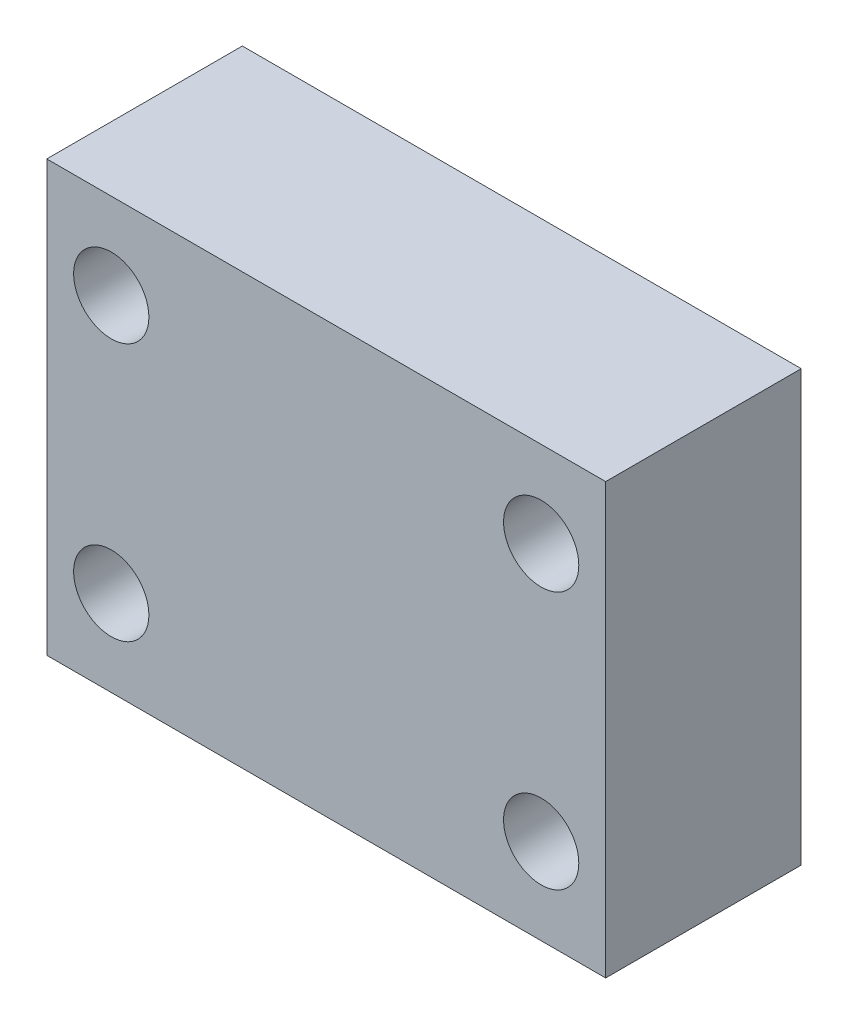
ISO-10303-21;
HEADER;
FILE_DESCRIPTION(('STEP AP214'),'2;1');
FILE_NAME('part.step','',(''),(''),'','','');
FILE_SCHEMA(('AUTOMOTIVE_DESIGN { 1 0 10303 214 1 1 1 1 }'));
ENDSEC;
DATA;
#1=APPLICATION_CONTEXT('core data for automotive mechanical design processes');
#2=APPLICATION_PROTOCOL_DEFINITION('international standard','automotive_design',2000,#1);
#3=PRODUCT_CONTEXT('',#1,'mechanical');
#4=PRODUCT('Part','Part','',(#3));
#5=PRODUCT_RELATED_PRODUCT_CATEGORY('part','',(#4));
#6=PRODUCT_DEFINITION_FORMATION('','',#4);
#7=PRODUCT_DEFINITION_CONTEXT('part definition',#1,'design');
#8=PRODUCT_DEFINITION('design','',#6,#7);
#9=PRODUCT_DEFINITION_SHAPE('','',#8);
#10=(LENGTH_UNIT() NAMED_UNIT(*) SI_UNIT(.MILLI.,.METRE.));
#11=(NAMED_UNIT(*) PLANE_ANGLE_UNIT() SI_UNIT($,.RADIAN.));
#12=(NAMED_UNIT(*) SI_UNIT($,.STERADIAN.) SOLID_ANGLE_UNIT());
#13=UNCERTAINTY_MEASURE_WITH_UNIT(LENGTH_MEASURE(1.E-05),#10,'distance_accuracy_value','');
#14=(GEOMETRIC_REPRESENTATION_CONTEXT(3) GLOBAL_UNCERTAINTY_ASSIGNED_CONTEXT((#13)) GLOBAL_UNIT_ASSIGNED_CONTEXT((#10,
#11,#12)) REPRESENTATION_CONTEXT('',''));
#15=CARTESIAN_POINT('',(0.,0.,0.));
#16=DIRECTION('',(0.,0.,1.));
#17=DIRECTION('',(1.,0.,0.));
#18=AXIS2_PLACEMENT_3D('',#15,#16,#17);
#19=CARTESIAN_POINT('',(0.,0.,18.19490677));
#20=DIRECTION('',(0.,0.,1.));
#21=DIRECTION('',(1.,0.,0.));
#22=AXIS2_PLACEMENT_3D('',#19,#20,#21);
#23=PLANE('',#22);
#24=CARTESIAN_POINT('',(6.,-32.,18.19490677));
#25=DIRECTION('',(0.,0.,1.));
#26=DIRECTION('',(1.,0.,0.));
#27=AXIS2_PLACEMENT_3D('',#24,#25,#26);
#28=CIRCLE('',#27,3.5);
#29=CARTESIAN_POINT('',(9.50000000000001,-32.,18.19490677));
#30=VERTEX_POINT('',#29);
#31=EDGE_CURVE('E142',#30,#30,#28,.T.);
#32=ORIENTED_EDGE('',*,*,#31,.F.);
#33=EDGE_LOOP('',(#32));
#34=FACE_BOUND('',#33,.T.);
#35=CARTESIAN_POINT('',(6.,-8.,18.19490677));
#36=DIRECTION('',(0.,0.,1.));
#37=DIRECTION('',(1.,0.,0.));
#38=AXIS2_PLACEMENT_3D('',#35,#36,#37);
#39=CIRCLE('',#38,3.5);
#40=CARTESIAN_POINT('',(9.5,-8.,18.19490677));
#41=VERTEX_POINT('',#40);
#42=EDGE_CURVE('E112',#41,#41,#39,.T.);
#43=ORIENTED_EDGE('',*,*,#42,.F.);
#44=EDGE_LOOP('',(#43));
#45=FACE_BOUND('',#44,.T.);
#46=DIRECTION('',(0.,-1.,0.));
#47=VECTOR('',#46,1.);
#48=CARTESIAN_POINT('',(0.,0.,18.19490677));
#49=LINE('',#48,#47);
#50=CARTESIAN_POINT('',(0.,0.,18.19490677));
#51=VERTEX_POINT('',#50);
#52=CARTESIAN_POINT('',(0.,-40.,18.19490677));
#53=VERTEX_POINT('',#52);
#54=EDGE_CURVE('E92',#51,#53,#49,.T.);
#55=ORIENTED_EDGE('',*,*,#54,.T.);
#56=DIRECTION('',(1.,0.,0.));
#57=VECTOR('',#56,1.);
#58=CARTESIAN_POINT('',(0.,-40.,18.19490677));
#59=LINE('',#58,#57);
#60=CARTESIAN_POINT('',(52.,-40.,18.19490677));
#61=VERTEX_POINT('',#60);
#62=EDGE_CURVE('E87',#53,#61,#59,.T.);
#63=ORIENTED_EDGE('',*,*,#62,.T.);
#64=DIRECTION('',(0.,1.,0.));
#65=VECTOR('',#64,1.);
#66=CARTESIAN_POINT('',(52.,0.,18.19490677));
#67=LINE('',#66,#65);
#68=CARTESIAN_POINT('',(52.,0.,18.19490677));
#69=VERTEX_POINT('',#68);
#70=EDGE_CURVE('E90',#61,#69,#67,.T.);
#71=ORIENTED_EDGE('',*,*,#70,.T.);
#72=DIRECTION('',(-1.,0.,0.));
#73=VECTOR('',#72,1.);
#74=CARTESIAN_POINT('',(0.,0.,18.19490677));
#75=LINE('',#74,#73);
#76=EDGE_CURVE('E57',#69,#51,#75,.T.);
#77=ORIENTED_EDGE('',*,*,#76,.T.);
#78=EDGE_LOOP('',(#55,#63,#71,#77));
#79=FACE_BOUND('',#78,.T.);
#80=CARTESIAN_POINT('',(46.,-8.,18.19490677));
#81=DIRECTION('',(0.,0.,1.));
#82=DIRECTION('',(1.,0.,0.));
#83=AXIS2_PLACEMENT_3D('',#80,#81,#82);
#84=CIRCLE('',#83,3.5);
#85=CARTESIAN_POINT('',(49.5,-8.,18.19490677));
#86=VERTEX_POINT('',#85);
#87=EDGE_CURVE('E134',#86,#86,#84,.T.);
#88=ORIENTED_EDGE('',*,*,#87,.F.);
#89=EDGE_LOOP('',(#88));
#90=FACE_BOUND('',#89,.T.);
#91=CARTESIAN_POINT('',(46.,-32.,18.19490677));
#92=DIRECTION('',(0.,0.,1.));
#93=DIRECTION('',(1.,0.,0.));
#94=AXIS2_PLACEMENT_3D('',#91,#92,#93);
#95=CIRCLE('',#94,3.5);
#96=CARTESIAN_POINT('',(49.5,-32.,18.19490677));
#97=VERTEX_POINT('',#96);
#98=EDGE_CURVE('E150',#97,#97,#95,.T.);
#99=ORIENTED_EDGE('',*,*,#98,.F.);
#100=EDGE_LOOP('',(#99));
#101=FACE_BOUND('',#100,.T.);
#102=ADVANCED_FACE('F39',(#34,#45,#79,#90,#101),#23,.T.);
#103=CARTESIAN_POINT('',(0.,0.,0.));
#104=DIRECTION('',(0.,0.,1.));
#105=DIRECTION('',(1.,0.,0.));
#106=AXIS2_PLACEMENT_3D('',#103,#104,#105);
#107=PLANE('',#106);
#108=DIRECTION('',(0.,-1.,0.));
#109=VECTOR('',#108,1.);
#110=CARTESIAN_POINT('',(0.,0.,0.));
#111=LINE('',#110,#109);
#112=CARTESIAN_POINT('',(0.,0.,0.));
#113=VERTEX_POINT('',#112);
#114=CARTESIAN_POINT('',(0.,-40.,0.));
#115=VERTEX_POINT('',#114);
#116=EDGE_CURVE('E108',#113,#115,#111,.T.);
#117=ORIENTED_EDGE('',*,*,#116,.F.);
#118=DIRECTION('',(-1.,0.,0.));
#119=VECTOR('',#118,1.);
#120=CARTESIAN_POINT('',(0.,0.,0.));
#121=LINE('',#120,#119);
#122=CARTESIAN_POINT('',(52.,0.,0.));
#123=VERTEX_POINT('',#122);
#124=EDGE_CURVE('E80',#123,#113,#121,.T.);
#125=ORIENTED_EDGE('',*,*,#124,.F.);
#126=DIRECTION('',(0.,1.,0.));
#127=VECTOR('',#126,1.);
#128=CARTESIAN_POINT('',(52.,0.,0.));
#129=LINE('',#128,#127);
#130=CARTESIAN_POINT('',(52.,-40.,0.));
#131=VERTEX_POINT('',#130);
#132=EDGE_CURVE('E74',#131,#123,#129,.T.);
#133=ORIENTED_EDGE('',*,*,#132,.F.);
#134=DIRECTION('',(1.,0.,0.));
#135=VECTOR('',#134,1.);
#136=CARTESIAN_POINT('',(0.,-40.,0.));
#137=LINE('',#136,#135);
#138=EDGE_CURVE('E97',#115,#131,#137,.T.);
#139=ORIENTED_EDGE('',*,*,#138,.F.);
#140=EDGE_LOOP('',(#117,#125,#133,#139));
#141=FACE_BOUND('',#140,.T.);
#142=CARTESIAN_POINT('',(6.,-8.,0.));
#143=DIRECTION('',(0.,0.,1.));
#144=DIRECTION('',(1.,0.,0.));
#145=AXIS2_PLACEMENT_3D('',#142,#143,#144);
#146=CIRCLE('',#145,3.5);
#147=CARTESIAN_POINT('',(9.5,-8.,0.));
#148=VERTEX_POINT('',#147);
#149=EDGE_CURVE('E130',#148,#148,#146,.T.);
#150=ORIENTED_EDGE('',*,*,#149,.T.);
#151=EDGE_LOOP('',(#150));
#152=FACE_BOUND('',#151,.T.);
#153=CARTESIAN_POINT('',(46.,-8.,0.));
#154=DIRECTION('',(0.,0.,1.));
#155=DIRECTION('',(1.,0.,0.));
#156=AXIS2_PLACEMENT_3D('',#153,#154,#155);
#157=CIRCLE('',#156,3.5);
#158=CARTESIAN_POINT('',(49.5,-8.,0.));
#159=VERTEX_POINT('',#158);
#160=EDGE_CURVE('E138',#159,#159,#157,.T.);
#161=ORIENTED_EDGE('',*,*,#160,.T.);
#162=EDGE_LOOP('',(#161));
#163=FACE_BOUND('',#162,.T.);
#164=CARTESIAN_POINT('',(6.,-32.,0.));
#165=DIRECTION('',(0.,0.,1.));
#166=DIRECTION('',(1.,0.,0.));
#167=AXIS2_PLACEMENT_3D('',#164,#165,#166);
#168=CIRCLE('',#167,3.5);
#169=CARTESIAN_POINT('',(9.50000000000001,-32.,0.));
#170=VERTEX_POINT('',#169);
#171=EDGE_CURVE('E146',#170,#170,#168,.T.);
#172=ORIENTED_EDGE('',*,*,#171,.T.);
#173=EDGE_LOOP('',(#172));
#174=FACE_BOUND('',#173,.T.);
#175=CARTESIAN_POINT('',(46.,-32.,0.));
#176=DIRECTION('',(0.,0.,1.));
#177=DIRECTION('',(1.,0.,0.));
#178=AXIS2_PLACEMENT_3D('',#175,#176,#177);
#179=CIRCLE('',#178,3.5);
#180=CARTESIAN_POINT('',(49.5,-32.,0.));
#181=VERTEX_POINT('',#180);
#182=EDGE_CURVE('E154',#181,#181,#179,.T.);
#183=ORIENTED_EDGE('',*,*,#182,.T.);
#184=EDGE_LOOP('',(#183));
#185=FACE_BOUND('',#184,.T.);
#186=ADVANCED_FACE('F125',(#141,#152,#163,#174,#185),#107,.F.);
#187=CARTESIAN_POINT('',(0.,0.,18.19490677));
#188=DIRECTION('',(1.,0.,0.));
#189=DIRECTION('',(0.,1.,0.));
#190=AXIS2_PLACEMENT_3D('',#187,#188,#189);
#191=PLANE('',#190);
#192=ORIENTED_EDGE('',*,*,#116,.T.);
#193=DIRECTION('',(0.,0.,-1.));
#194=VECTOR('',#193,1.);
#195=CARTESIAN_POINT('',(0.,-40.,18.19490677));
#196=LINE('',#195,#194);
#197=EDGE_CURVE('E11',#53,#115,#196,.T.);
#198=ORIENTED_EDGE('',*,*,#197,.F.);
#199=ORIENTED_EDGE('',*,*,#54,.F.);
#200=DIRECTION('',(0.,0.,-1.));
#201=VECTOR('',#200,1.);
#202=CARTESIAN_POINT('',(0.,0.,18.19490677));
#203=LINE('',#202,#201);
#204=EDGE_CURVE('E104',#51,#113,#203,.T.);
#205=ORIENTED_EDGE('',*,*,#204,.T.);
#206=EDGE_LOOP('',(#192,#198,#199,#205));
#207=FACE_BOUND('',#206,.T.);
#208=ADVANCED_FACE('F41',(#207),#191,.F.);
#209=CARTESIAN_POINT('',(0.,-40.,18.19490677));
#210=DIRECTION('',(0.,1.,0.));
#211=DIRECTION('',(0.,0.,1.));
#212=AXIS2_PLACEMENT_3D('',#209,#210,#211);
#213=PLANE('',#212);
#214=ORIENTED_EDGE('',*,*,#138,.T.);
#215=DIRECTION('',(0.,0.,-1.));
#216=VECTOR('',#215,1.);
#217=CARTESIAN_POINT('',(52.,-40.,18.19490677));
#218=LINE('',#217,#216);
#219=EDGE_CURVE('E49',#61,#131,#218,.T.);
#220=ORIENTED_EDGE('',*,*,#219,.F.);
#221=ORIENTED_EDGE('',*,*,#62,.F.);
#222=ORIENTED_EDGE('',*,*,#197,.T.);
#223=EDGE_LOOP('',(#214,#220,#221,#222));
#224=FACE_BOUND('',#223,.T.);
#225=ADVANCED_FACE('F96',(#224),#213,.F.);
#226=CARTESIAN_POINT('',(52.,0.,18.19490677));
#227=DIRECTION('',(-1.,0.,0.));
#228=DIRECTION('',(0.,-1.,0.));
#229=AXIS2_PLACEMENT_3D('',#226,#227,#228);
#230=PLANE('',#229);
#231=ORIENTED_EDGE('',*,*,#132,.T.);
#232=DIRECTION('',(0.,0.,-1.));
#233=VECTOR('',#232,1.);
#234=CARTESIAN_POINT('',(52.,0.,18.19490677));
#235=LINE('',#234,#233);
#236=EDGE_CURVE('E99',#69,#123,#235,.T.);
#237=ORIENTED_EDGE('',*,*,#236,.F.);
#238=ORIENTED_EDGE('',*,*,#70,.F.);
#239=ORIENTED_EDGE('',*,*,#219,.T.);
#240=EDGE_LOOP('',(#231,#237,#238,#239));
#241=FACE_BOUND('',#240,.T.);
#242=ADVANCED_FACE('F100',(#241),#230,.F.);
#243=CARTESIAN_POINT('',(0.,0.,18.19490677));
#244=DIRECTION('',(0.,-1.,0.));
#245=DIRECTION('',(0.,0.,-1.));
#246=AXIS2_PLACEMENT_3D('',#243,#244,#245);
#247=PLANE('',#246);
#248=ORIENTED_EDGE('',*,*,#124,.T.);
#249=ORIENTED_EDGE('',*,*,#204,.F.);
#250=ORIENTED_EDGE('',*,*,#76,.F.);
#251=ORIENTED_EDGE('',*,*,#236,.T.);
#252=EDGE_LOOP('',(#248,#249,#250,#251));
#253=FACE_BOUND('',#252,.T.);
#254=ADVANCED_FACE('F122',(#253),#247,.F.);
#255=CARTESIAN_POINT('',(6.,-8.,18.19490677));
#256=DIRECTION('',(0.,0.,-1.));
#257=DIRECTION('',(-1.,0.,0.));
#258=AXIS2_PLACEMENT_3D('',#255,#256,#257);
#259=CYLINDRICAL_SURFACE('',#258,3.5);
#260=ORIENTED_EDGE('',*,*,#42,.T.);
#261=EDGE_LOOP('',(#260));
#262=FACE_BOUND('',#261,.T.);
#263=ORIENTED_EDGE('',*,*,#149,.F.);
#264=EDGE_LOOP('',(#263));
#265=FACE_BOUND('',#264,.T.);
#266=ADVANCED_FACE('F175',(#262,#265),#259,.F.);
#267=CARTESIAN_POINT('',(46.,-8.,18.19490677));
#268=DIRECTION('',(0.,0.,-1.));
#269=DIRECTION('',(-1.,0.,0.));
#270=AXIS2_PLACEMENT_3D('',#267,#268,#269);
#271=CYLINDRICAL_SURFACE('',#270,3.5);
#272=ORIENTED_EDGE('',*,*,#87,.T.);
#273=EDGE_LOOP('',(#272));
#274=FACE_BOUND('',#273,.T.);
#275=ORIENTED_EDGE('',*,*,#160,.F.);
#276=EDGE_LOOP('',(#275));
#277=FACE_BOUND('',#276,.T.);
#278=ADVANCED_FACE('F221',(#274,#277),#271,.F.);
#279=CARTESIAN_POINT('',(6.,-32.,18.19490677));
#280=DIRECTION('',(0.,0.,-1.));
#281=DIRECTION('',(-1.,0.,0.));
#282=AXIS2_PLACEMENT_3D('',#279,#280,#281);
#283=CYLINDRICAL_SURFACE('',#282,3.5);
#284=ORIENTED_EDGE('',*,*,#31,.T.);
#285=EDGE_LOOP('',(#284));
#286=FACE_BOUND('',#285,.T.);
#287=ORIENTED_EDGE('',*,*,#171,.F.);
#288=EDGE_LOOP('',(#287));
#289=FACE_BOUND('',#288,.T.);
#290=ADVANCED_FACE('F229',(#286,#289),#283,.F.);
#291=CARTESIAN_POINT('',(46.,-32.,18.19490677));
#292=DIRECTION('',(0.,0.,-1.));
#293=DIRECTION('',(-1.,0.,0.));
#294=AXIS2_PLACEMENT_3D('',#291,#292,#293);
#295=CYLINDRICAL_SURFACE('',#294,3.5);
#296=ORIENTED_EDGE('',*,*,#98,.T.);
#297=EDGE_LOOP('',(#296));
#298=FACE_BOUND('',#297,.T.);
#299=ORIENTED_EDGE('',*,*,#182,.F.);
#300=EDGE_LOOP('',(#299));
#301=FACE_BOUND('',#300,.T.);
#302=ADVANCED_FACE('F162',(#298,#301),#295,.F.);
#303=CLOSED_SHELL('',(#102,#186,#208,#225,#242,#254,#266,#278,#290,#302));
#304=MANIFOLD_SOLID_BREP('B2',#303);
#305=ADVANCED_BREP_SHAPE_REPRESENTATION('',(#18,#304),#14);
#306=SHAPE_DEFINITION_REPRESENTATION(#9,#305);
ENDSEC;
END-ISO-10303-21;
